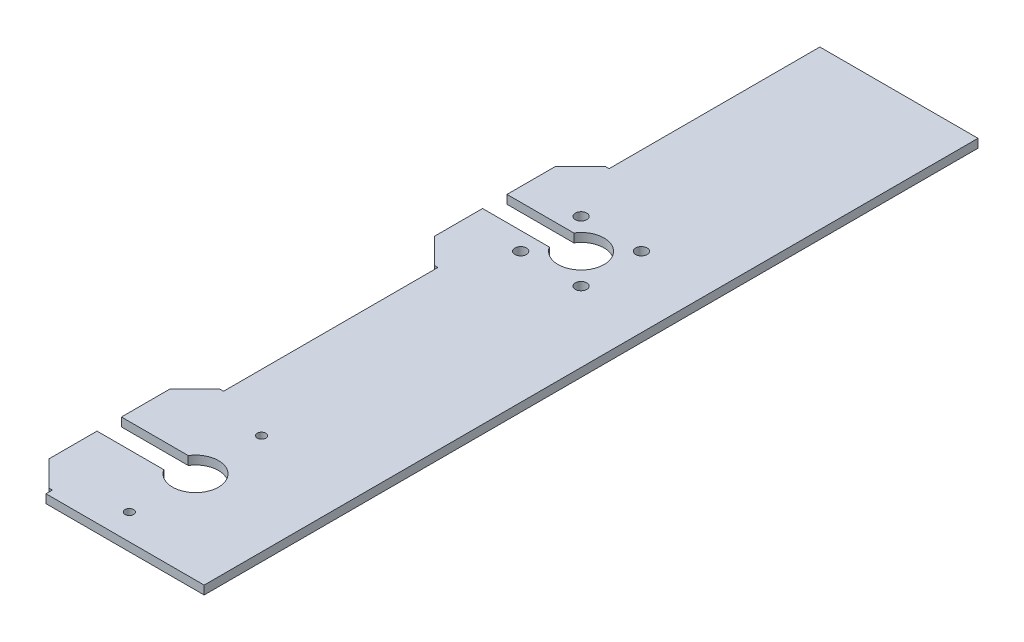
ISO-10303-21;
HEADER;
FILE_DESCRIPTION(('STEP AP214'),'2;1');
FILE_NAME('part.step','',(''),(''),'','','');
FILE_SCHEMA(('AUTOMOTIVE_DESIGN { 1 0 10303 214 1 1 1 1 }'));
ENDSEC;
DATA;
#1=APPLICATION_CONTEXT('core data for automotive mechanical design processes');
#2=APPLICATION_PROTOCOL_DEFINITION('international standard','automotive_design',2000,#1);
#3=PRODUCT_CONTEXT('',#1,'mechanical');
#4=PRODUCT('Part','Part','',(#3));
#5=PRODUCT_RELATED_PRODUCT_CATEGORY('part','',(#4));
#6=PRODUCT_DEFINITION_FORMATION('','',#4);
#7=PRODUCT_DEFINITION_CONTEXT('part definition',#1,'design');
#8=PRODUCT_DEFINITION('design','',#6,#7);
#9=PRODUCT_DEFINITION_SHAPE('','',#8);
#10=(LENGTH_UNIT() NAMED_UNIT(*) SI_UNIT(.MILLI.,.METRE.));
#11=(NAMED_UNIT(*) PLANE_ANGLE_UNIT() SI_UNIT($,.RADIAN.));
#12=(NAMED_UNIT(*) SI_UNIT($,.STERADIAN.) SOLID_ANGLE_UNIT());
#13=UNCERTAINTY_MEASURE_WITH_UNIT(LENGTH_MEASURE(1.E-05),#10,'distance_accuracy_value','');
#14=(GEOMETRIC_REPRESENTATION_CONTEXT(3) GLOBAL_UNCERTAINTY_ASSIGNED_CONTEXT((#13)) GLOBAL_UNIT_ASSIGNED_CONTEXT((#10,
#11,#12)) REPRESENTATION_CONTEXT('',''));
#15=CARTESIAN_POINT('',(0.,0.,0.));
#16=DIRECTION('',(0.,0.,1.));
#17=DIRECTION('',(1.,0.,0.));
#18=AXIS2_PLACEMENT_3D('',#15,#16,#17);
#19=CARTESIAN_POINT('',(-27.5,-3.,34.0400430645094));
#20=DIRECTION('',(1.,0.,0.));
#21=DIRECTION('',(0.,1.,0.));
#22=AXIS2_PLACEMENT_3D('',#19,#20,#21);
#23=PLANE('',#22);
#24=DIRECTION('',(0.,0.,-1.));
#25=VECTOR('',#24,1.);
#26=CARTESIAN_POINT('',(-27.5,-3.,34.0400430645094));
#27=LINE('',#26,#25);
#28=CARTESIAN_POINT('',(-27.5,-3.00000000000027,104.316686129019));
#29=VERTEX_POINT('',#28);
#30=CARTESIAN_POINT('',(-27.5,-3.,29.7634));
#31=VERTEX_POINT('',#30);
#32=EDGE_CURVE('E114',#29,#31,#27,.T.);
#33=ORIENTED_EDGE('',*,*,#32,.F.);
#34=DIRECTION('',(0.,-1.,0.));
#35=VECTOR('',#34,1.);
#36=CARTESIAN_POINT('',(-27.5,-2.70616862252382E-13,104.316686129019));
#37=LINE('',#36,#35);
#38=CARTESIAN_POINT('',(-27.5,-2.70616862252382E-13,104.316686129019));
#39=VERTEX_POINT('',#38);
#40=EDGE_CURVE('E372',#39,#29,#37,.T.);
#41=ORIENTED_EDGE('',*,*,#40,.F.);
#42=DIRECTION('',(0.,0.,1.));
#43=VECTOR('',#42,1.);
#44=CARTESIAN_POINT('',(-27.5,0.,34.0400430645094));
#45=LINE('',#44,#43);
#46=CARTESIAN_POINT('',(-27.5,0.,29.7634));
#47=VERTEX_POINT('',#46);
#48=EDGE_CURVE('E108',#39,#47,#45,.F.);
#49=ORIENTED_EDGE('',*,*,#48,.T.);
#50=DIRECTION('',(0.,-1.,0.));
#51=VECTOR('',#50,1.);
#52=CARTESIAN_POINT('',(-27.5,0.,29.7634));
#53=LINE('',#52,#51);
#54=EDGE_CURVE('E411',#47,#31,#53,.T.);
#55=ORIENTED_EDGE('',*,*,#54,.T.);
#56=EDGE_LOOP('',(#33,#41,#49,#55));
#57=FACE_BOUND('',#56,.T.);
#58=ADVANCED_FACE('F104',(#57),#23,.F.);
#59=CARTESIAN_POINT('',(27.5,-3.00000000000025,103.040043064509));
#60=DIRECTION('',(-1.,0.,0.));
#61=DIRECTION('',(0.,0.,-1.));
#62=AXIS2_PLACEMENT_3D('',#59,#60,#61);
#63=PLANE('',#62);
#64=DIRECTION('',(0.,0.,-1.));
#65=VECTOR('',#64,1.);
#66=CARTESIAN_POINT('',(27.5,-2.42861286636753E-13,103.040043064509));
#67=LINE('',#66,#65);
#68=CARTESIAN_POINT('',(27.5,-4.64905891561784E-13,-103.040043064509));
#69=VERTEX_POINT('',#68);
#70=CARTESIAN_POINT('',(27.5,-9.0205620750794E-13,166.070086129019));
#71=VERTEX_POINT('',#70);
#72=EDGE_CURVE('E278',#69,#71,#67,.F.);
#73=ORIENTED_EDGE('',*,*,#72,.T.);
#74=DIRECTION('',(0.,1.,0.));
#75=VECTOR('',#74,1.);
#76=CARTESIAN_POINT('',(27.5,-3.0000000000009,166.070086129019));
#77=LINE('',#76,#75);
#78=CARTESIAN_POINT('',(27.5,-3.0000000000009,166.070086129019));
#79=VERTEX_POINT('',#78);
#80=EDGE_CURVE('E377',#79,#71,#77,.T.);
#81=ORIENTED_EDGE('',*,*,#80,.F.);
#82=DIRECTION('',(0.,0.,1.));
#83=VECTOR('',#82,1.);
#84=CARTESIAN_POINT('',(27.5,-3.,34.0400430645094));
#85=LINE('',#84,#83);
#86=CARTESIAN_POINT('',(27.5,-3.00000000000047,-103.040043064509));
#87=VERTEX_POINT('',#86);
#88=EDGE_CURVE('E13',#87,#79,#85,.T.);
#89=ORIENTED_EDGE('',*,*,#88,.F.);
#90=DIRECTION('',(0.,1.,0.));
#91=VECTOR('',#90,1.);
#92=CARTESIAN_POINT('',(27.5,-3.00000000000047,-103.040043064509));
#93=LINE('',#92,#91);
#94=EDGE_CURVE('E292',#87,#69,#93,.T.);
#95=ORIENTED_EDGE('',*,*,#94,.T.);
#96=EDGE_LOOP('',(#73,#81,#89,#95));
#97=FACE_BOUND('',#96,.T.);
#98=ADVANCED_FACE('F295',(#97),#63,.F.);
#99=CARTESIAN_POINT('',(0.,-3.,34.0400430645094));
#100=DIRECTION('',(0.,1.,0.));
#101=DIRECTION('',(-1.,0.,0.));
#102=AXIS2_PLACEMENT_3D('',#99,#100,#101);
#103=PLANE('',#102);
#104=ORIENTED_EDGE('',*,*,#88,.T.);
#105=DIRECTION('',(-1.,0.,0.));
#106=VECTOR('',#105,1.);
#107=CARTESIAN_POINT('',(0.,-3.0000000000009,166.070086129019));
#108=LINE('',#107,#106);
#109=CARTESIAN_POINT('',(-27.5,-3.0000000000009,166.070086129019));
#110=VERTEX_POINT('',#109);
#111=EDGE_CURVE('E331',#79,#110,#108,.T.);
#112=ORIENTED_EDGE('',*,*,#111,.T.);
#113=DIRECTION('',(0.,0.,-1.));
#114=VECTOR('',#113,1.);
#115=CARTESIAN_POINT('',(-27.5,-3.00000000000057,134.080086129019));
#116=LINE('',#115,#114);
#117=CARTESIAN_POINT('',(-27.5,-3.00000000000087,163.843486129019));
#118=VERTEX_POINT('',#117);
#119=EDGE_CURVE('E328',#110,#118,#116,.T.);
#120=ORIENTED_EDGE('',*,*,#119,.T.);
#121=DIRECTION('',(-1.,0.,0.));
#122=VECTOR('',#121,1.);
#123=CARTESIAN_POINT('',(-28.7366,-3.00000000000087,163.843486129019));
#124=LINE('',#123,#122);
#125=CARTESIAN_POINT('',(-28.7366,-3.00000000000087,163.843486129019));
#126=VERTEX_POINT('',#125);
#127=EDGE_CURVE('E325',#118,#126,#124,.T.);
#128=ORIENTED_EDGE('',*,*,#127,.T.);
#129=DIRECTION('',(-0.707106781186549,0.,-0.707106781186546));
#130=VECTOR('',#129,1.);
#131=CARTESIAN_POINT('',(-37.5,-3.00000000000079,155.080086129019));
#132=LINE('',#131,#130);
#133=CARTESIAN_POINT('',(-37.5,-3.00000000000079,155.080086129019));
#134=VERTEX_POINT('',#133);
#135=EDGE_CURVE('E321',#126,#134,#132,.T.);
#136=ORIENTED_EDGE('',*,*,#135,.T.);
#137=DIRECTION('',(0.,0.,-1.));
#138=VECTOR('',#137,1.);
#139=CARTESIAN_POINT('',(-37.5,-3.00000000000036,113.080086129019));
#140=LINE('',#139,#138);
#141=CARTESIAN_POINT('',(-37.5,-3.00000000000061,138.330086129019));
#142=VERTEX_POINT('',#141);
#143=EDGE_CURVE('E318',#134,#142,#140,.T.);
#144=ORIENTED_EDGE('',*,*,#143,.T.);
#145=DIRECTION('',(-1.,0.,0.));
#146=VECTOR('',#145,1.);
#147=CARTESIAN_POINT('',(-37.5,-3.00000000000061,138.330086129019));
#148=LINE('',#147,#146);
#149=CARTESIAN_POINT('',(-14.277720855863,-3.00000000000061,138.330086129019));
#150=VERTEX_POINT('',#149);
#151=EDGE_CURVE('E394',#150,#142,#148,.T.);
#152=ORIENTED_EDGE('',*,*,#151,.F.);
#153=CARTESIAN_POINT('',(-7.50000000000002,-3.00000000000057,134.080086129019));
#154=DIRECTION('',(0.,-1.,0.));
#155=DIRECTION('',(0.,0.,-1.));
#156=AXIS2_PLACEMENT_3D('',#153,#154,#155);
#157=CIRCLE('',#156,8.);
#158=CARTESIAN_POINT('',(-14.277720855863,-3.00000000000053,129.830086129019));
#159=VERTEX_POINT('',#158);
#160=EDGE_CURVE('E346',#159,#150,#157,.T.);
#161=ORIENTED_EDGE('',*,*,#160,.F.);
#162=DIRECTION('',(1.,0.,0.));
#163=VECTOR('',#162,1.);
#164=CARTESIAN_POINT('',(-37.5,-3.00000000000053,129.830086129019));
#165=LINE('',#164,#163);
#166=CARTESIAN_POINT('',(-37.5,-3.00000000000053,129.830086129019));
#167=VERTEX_POINT('',#166);
#168=EDGE_CURVE('E352',#167,#159,#165,.T.);
#169=ORIENTED_EDGE('',*,*,#168,.F.);
#170=CARTESIAN_POINT('',(-37.5,-3.00000000000036,113.080086129019));
#171=VERTEX_POINT('',#170);
#172=EDGE_CURVE('E322',#167,#171,#140,.T.);
#173=ORIENTED_EDGE('',*,*,#172,.T.);
#174=DIRECTION('',(0.707106781186548,0.,-0.707106781186547));
#175=VECTOR('',#174,1.);
#176=CARTESIAN_POINT('',(-28.7366,-3.00000000000027,104.316686129019));
#177=LINE('',#176,#175);
#178=CARTESIAN_POINT('',(-28.7366,-3.00000000000027,104.316686129019));
#179=VERTEX_POINT('',#178);
#180=EDGE_CURVE('E336',#171,#179,#177,.T.);
#181=ORIENTED_EDGE('',*,*,#180,.T.);
#182=DIRECTION('',(1.,0.,0.));
#183=VECTOR('',#182,1.);
#184=CARTESIAN_POINT('',(-27.5,-3.00000000000027,104.316686129019));
#185=LINE('',#184,#183);
#186=EDGE_CURVE('E333',#179,#29,#185,.T.);
#187=ORIENTED_EDGE('',*,*,#186,.T.);
#188=ORIENTED_EDGE('',*,*,#32,.T.);
#189=DIRECTION('',(-1.,0.,0.));
#190=VECTOR('',#189,1.);
#191=CARTESIAN_POINT('',(0.,-3.,29.7634));
#192=LINE('',#191,#190);
#193=CARTESIAN_POINT('',(-28.7366,-3.,29.7634));
#194=VERTEX_POINT('',#193);
#195=EDGE_CURVE('E403',#31,#194,#192,.T.);
#196=ORIENTED_EDGE('',*,*,#195,.T.);
#197=DIRECTION('',(0.707106781186548,0.,0.707106781186547));
#198=VECTOR('',#197,1.);
#199=CARTESIAN_POINT('',(-37.5,-3.,21.));
#200=LINE('',#199,#198);
#201=CARTESIAN_POINT('',(-37.5,-3.,21.));
#202=VERTEX_POINT('',#201);
#203=EDGE_CURVE('E481',#202,#194,#200,.T.);
#204=ORIENTED_EDGE('',*,*,#203,.F.);
#205=DIRECTION('',(0.,0.,1.));
#206=VECTOR('',#205,1.);
#207=CARTESIAN_POINT('',(-37.5,-3.,-21.));
#208=LINE('',#207,#206);
#209=CARTESIAN_POINT('',(-37.5,-2.99999999999989,4.24999999999998));
#210=VERTEX_POINT('',#209);
#211=EDGE_CURVE('E462',#210,#202,#208,.T.);
#212=ORIENTED_EDGE('',*,*,#211,.F.);
#213=DIRECTION('',(1.,0.,0.));
#214=VECTOR('',#213,1.);
#215=CARTESIAN_POINT('',(-37.5,-2.99999999999989,4.24999999999998));
#216=LINE('',#215,#214);
#217=CARTESIAN_POINT('',(-14.277720855863,-2.99999999999989,4.24999999999998));
#218=VERTEX_POINT('',#217);
#219=EDGE_CURVE('E444',#210,#218,#216,.T.);
#220=ORIENTED_EDGE('',*,*,#219,.T.);
#221=CARTESIAN_POINT('',(-7.50000000000001,-3.,0.));
#222=DIRECTION('',(0.,1.,0.));
#223=DIRECTION('',(0.,0.,1.));
#224=AXIS2_PLACEMENT_3D('',#221,#222,#223);
#225=CIRCLE('',#224,8.);
#226=CARTESIAN_POINT('',(-14.277720855863,-3.,-4.25000000000002));
#227=VERTEX_POINT('',#226);
#228=EDGE_CURVE('E441',#218,#227,#225,.T.);
#229=ORIENTED_EDGE('',*,*,#228,.T.);
#230=DIRECTION('',(-1.,0.,0.));
#231=VECTOR('',#230,1.);
#232=CARTESIAN_POINT('',(-37.5,-2.99999999999986,-4.25000000000002));
#233=LINE('',#232,#231);
#234=CARTESIAN_POINT('',(-37.5,-2.99999999999986,-4.25000000000002));
#235=VERTEX_POINT('',#234);
#236=EDGE_CURVE('E438',#227,#235,#233,.T.);
#237=ORIENTED_EDGE('',*,*,#236,.T.);
#238=CARTESIAN_POINT('',(-37.5,-3.,-21.));
#239=VERTEX_POINT('',#238);
#240=EDGE_CURVE('E458',#239,#235,#208,.T.);
#241=ORIENTED_EDGE('',*,*,#240,.F.);
#242=DIRECTION('',(-0.707106781186549,0.,0.707106781186546));
#243=VECTOR('',#242,1.);
#244=CARTESIAN_POINT('',(-27.5,-3.,-31.));
#245=LINE('',#244,#243);
#246=CARTESIAN_POINT('',(-28.7366,-3.,-29.7634));
#247=VERTEX_POINT('',#246);
#248=EDGE_CURVE('E467',#247,#239,#245,.T.);
#249=ORIENTED_EDGE('',*,*,#248,.F.);
#250=DIRECTION('',(1.,0.,0.));
#251=VECTOR('',#250,1.);
#252=CARTESIAN_POINT('',(0.,-3.,-29.7634));
#253=LINE('',#252,#251);
#254=CARTESIAN_POINT('',(-27.5,-3.,-29.7634));
#255=VERTEX_POINT('',#254);
#256=EDGE_CURVE('E415',#247,#255,#253,.T.);
#257=ORIENTED_EDGE('',*,*,#256,.T.);
#258=DIRECTION('',(0.,0.,-1.));
#259=VECTOR('',#258,1.);
#260=CARTESIAN_POINT('',(-27.5,-3.,-34.0400430645093));
#261=LINE('',#260,#259);
#262=CARTESIAN_POINT('',(-27.5,-3.00000000000047,-103.040043064509));
#263=VERTEX_POINT('',#262);
#264=EDGE_CURVE('E297',#255,#263,#261,.T.);
#265=ORIENTED_EDGE('',*,*,#264,.T.);
#266=DIRECTION('',(1.,0.,0.));
#267=VECTOR('',#266,1.);
#268=CARTESIAN_POINT('',(0.,-3.00000000000047,-103.040043064509));
#269=LINE('',#268,#267);
#270=EDGE_CURVE('E299',#263,#87,#269,.T.);
#271=ORIENTED_EDGE('',*,*,#270,.T.);
#272=EDGE_LOOP('',(#104,#112,#120,#128,#136,#144,#152,#161,#169,#173,#181,#187,#188,#196,#204,
#212,#220,#229,#237,#241,#249,#257,#265,#271));
#273=FACE_BOUND('',#272,.T.);
#274=CARTESIAN_POINT('',(-7.50000000000002,-3.00000000000033,111.080086129019));
#275=DIRECTION('',(0.,-1.,0.));
#276=DIRECTION('',(0.,0.,-1.));
#277=AXIS2_PLACEMENT_3D('',#274,#275,#276);
#278=CIRCLE('',#277,1.5);
#279=CARTESIAN_POINT('',(-7.50000000000002,-3.00000000000031,109.580086129019));
#280=VERTEX_POINT('',#279);
#281=EDGE_CURVE('E339',#280,#280,#278,.T.);
#282=ORIENTED_EDGE('',*,*,#281,.F.);
#283=EDGE_LOOP('',(#282));
#284=FACE_BOUND('',#283,.T.);
#285=CARTESIAN_POINT('',(-7.50000000000002,-3.00000000000082,157.080086129019));
#286=DIRECTION('',(0.,-1.,0.));
#287=DIRECTION('',(0.,0.,-1.));
#288=AXIS2_PLACEMENT_3D('',#285,#286,#287);
#289=CIRCLE('',#288,1.5);
#290=CARTESIAN_POINT('',(-7.50000000000002,-3.00000000000081,155.580086129019));
#291=VERTEX_POINT('',#290);
#292=EDGE_CURVE('E342',#291,#291,#289,.T.);
#293=ORIENTED_EDGE('',*,*,#292,.F.);
#294=EDGE_LOOP('',(#293));
#295=FACE_BOUND('',#294,.T.);
#296=CARTESIAN_POINT('',(-18.,-3.,10.5));
#297=DIRECTION('',(0.,1.,0.));
#298=DIRECTION('',(0.,0.,1.));
#299=AXIS2_PLACEMENT_3D('',#296,#297,#298);
#300=CIRCLE('',#299,2.);
#301=CARTESIAN_POINT('',(-18.,-3.,12.5));
#302=VERTEX_POINT('',#301);
#303=EDGE_CURVE('E414',#302,#302,#300,.T.);
#304=ORIENTED_EDGE('',*,*,#303,.T.);
#305=EDGE_LOOP('',(#304));
#306=FACE_BOUND('',#305,.T.);
#307=CARTESIAN_POINT('',(2.99999999999999,-3.,10.5));
#308=DIRECTION('',(0.,1.,0.));
#309=DIRECTION('',(0.,0.,1.));
#310=AXIS2_PLACEMENT_3D('',#307,#308,#309);
#311=CIRCLE('',#310,2.);
#312=CARTESIAN_POINT('',(2.99999999999999,-3.,12.5));
#313=VERTEX_POINT('',#312);
#314=EDGE_CURVE('E431',#313,#313,#311,.T.);
#315=ORIENTED_EDGE('',*,*,#314,.T.);
#316=EDGE_LOOP('',(#315));
#317=FACE_BOUND('',#316,.T.);
#318=CARTESIAN_POINT('',(2.99999999999999,-3.,-10.5));
#319=DIRECTION('',(0.,1.,0.));
#320=DIRECTION('',(0.,0.,1.));
#321=AXIS2_PLACEMENT_3D('',#318,#319,#320);
#322=CIRCLE('',#321,2.);
#323=CARTESIAN_POINT('',(2.99999999999999,-3.,-8.5));
#324=VERTEX_POINT('',#323);
#325=EDGE_CURVE('E425',#324,#324,#322,.T.);
#326=ORIENTED_EDGE('',*,*,#325,.T.);
#327=EDGE_LOOP('',(#326));
#328=FACE_BOUND('',#327,.T.);
#329=CARTESIAN_POINT('',(-18.,-3.,-10.5));
#330=DIRECTION('',(0.,1.,0.));
#331=DIRECTION('',(0.,0.,1.));
#332=AXIS2_PLACEMENT_3D('',#329,#330,#331);
#333=CIRCLE('',#332,2.);
#334=CARTESIAN_POINT('',(-18.,-3.,-8.5));
#335=VERTEX_POINT('',#334);
#336=EDGE_CURVE('E419',#335,#335,#333,.T.);
#337=ORIENTED_EDGE('',*,*,#336,.T.);
#338=EDGE_LOOP('',(#337));
#339=FACE_BOUND('',#338,.T.);
#340=ADVANCED_FACE('F400',(#273,#284,#295,#306,#317,#328,#339),#103,.F.);
#341=CARTESIAN_POINT('',(0.,0.,0.));
#342=DIRECTION('',(0.,-1.,0.));
#343=DIRECTION('',(0.,0.,-1.));
#344=AXIS2_PLACEMENT_3D('',#341,#342,#343);
#345=PLANE('',#344);
#346=ORIENTED_EDGE('',*,*,#48,.F.);
#347=DIRECTION('',(1.,0.,0.));
#348=VECTOR('',#347,1.);
#349=CARTESIAN_POINT('',(-27.5,-2.70616862252382E-13,104.316686129019));
#350=LINE('',#349,#348);
#351=CARTESIAN_POINT('',(-28.7366,-2.70616862252382E-13,104.316686129019));
#352=VERTEX_POINT('',#351);
#353=EDGE_CURVE('E374',#352,#39,#350,.T.);
#354=ORIENTED_EDGE('',*,*,#353,.F.);
#355=DIRECTION('',(0.707106781186548,0.,-0.707106781186547));
#356=VECTOR('',#355,1.);
#357=CARTESIAN_POINT('',(-28.7366,-2.70616862252382E-13,104.316686129019));
#358=LINE('',#357,#356);
#359=CARTESIAN_POINT('',(-37.5,-3.60822483003176E-13,113.080086129019));
#360=VERTEX_POINT('',#359);
#361=EDGE_CURVE('E369',#360,#352,#358,.T.);
#362=ORIENTED_EDGE('',*,*,#361,.F.);
#363=DIRECTION('',(0.,0.,-1.));
#364=VECTOR('',#363,1.);
#365=CARTESIAN_POINT('',(-37.5,-3.60822483003176E-13,113.080086129019));
#366=LINE('',#365,#364);
#367=CARTESIAN_POINT('',(-37.5,-4.71844785465692E-13,129.830086129019));
#368=VERTEX_POINT('',#367);
#369=EDGE_CURVE('E361',#368,#360,#366,.T.);
#370=ORIENTED_EDGE('',*,*,#369,.F.);
#371=DIRECTION('',(-1.,0.,0.));
#372=VECTOR('',#371,1.);
#373=CARTESIAN_POINT('',(0.,-5.27355936696949E-13,129.830086129019));
#374=LINE('',#373,#372);
#375=CARTESIAN_POINT('',(-14.277720855863,-5.13478148889135E-13,129.830086129019));
#376=VERTEX_POINT('',#375);
#377=EDGE_CURVE('E356',#376,#368,#374,.T.);
#378=ORIENTED_EDGE('',*,*,#377,.F.);
#379=CARTESIAN_POINT('',(-7.50000000000002,-5.68989300120393E-13,134.080086129019));
#380=DIRECTION('',(0.,-1.,0.));
#381=DIRECTION('',(0.,0.,-1.));
#382=AXIS2_PLACEMENT_3D('',#379,#380,#381);
#383=CIRCLE('',#382,8.);
#384=CARTESIAN_POINT('',(-14.277720855863,-6.10622663543836E-13,138.330086129019));
#385=VERTEX_POINT('',#384);
#386=EDGE_CURVE('E315',#376,#385,#383,.T.);
#387=ORIENTED_EDGE('',*,*,#386,.T.);
#388=DIRECTION('',(1.,0.,0.));
#389=VECTOR('',#388,1.);
#390=CARTESIAN_POINT('',(0.,-6.10622663543836E-13,138.330086129019));
#391=LINE('',#390,#389);
#392=CARTESIAN_POINT('',(-37.5,-5.27355936696949E-13,138.330086129019));
#393=VERTEX_POINT('',#392);
#394=EDGE_CURVE('E197',#393,#385,#391,.T.);
#395=ORIENTED_EDGE('',*,*,#394,.F.);
#396=CARTESIAN_POINT('',(-37.5,-7.84095011141517E-13,155.080086129019));
#397=VERTEX_POINT('',#396);
#398=EDGE_CURVE('E362',#397,#393,#366,.T.);
#399=ORIENTED_EDGE('',*,*,#398,.F.);
#400=DIRECTION('',(-0.707106781186549,0.,-0.707106781186546));
#401=VECTOR('',#400,1.);
#402=CARTESIAN_POINT('',(-37.5,-7.84095011141517E-13,155.080086129019));
#403=LINE('',#402,#401);
#404=CARTESIAN_POINT('',(-28.7366,-8.67361737988404E-13,163.843486129019));
#405=VERTEX_POINT('',#404);
#406=EDGE_CURVE('E365',#405,#397,#403,.T.);
#407=ORIENTED_EDGE('',*,*,#406,.F.);
#408=DIRECTION('',(-1.,0.,0.));
#409=VECTOR('',#408,1.);
#410=CARTESIAN_POINT('',(-28.7366,-8.67361737988404E-13,163.843486129019));
#411=LINE('',#410,#409);
#412=CARTESIAN_POINT('',(-27.5,-8.67361737988404E-13,163.843486129019));
#413=VERTEX_POINT('',#412);
#414=EDGE_CURVE('E385',#413,#405,#411,.T.);
#415=ORIENTED_EDGE('',*,*,#414,.F.);
#416=DIRECTION('',(0.,0.,1.));
#417=VECTOR('',#416,1.);
#418=CARTESIAN_POINT('',(-27.5,-2.35922392732846E-13,102.080086129019));
#419=LINE('',#418,#417);
#420=CARTESIAN_POINT('',(-27.5,-9.0205620750794E-13,166.070086129019));
#421=VERTEX_POINT('',#420);
#422=EDGE_CURVE('E305',#421,#413,#419,.F.);
#423=ORIENTED_EDGE('',*,*,#422,.F.);
#424=DIRECTION('',(1.,0.,0.));
#425=VECTOR('',#424,1.);
#426=CARTESIAN_POINT('',(-27.5,-9.0205620750794E-13,166.070086129019));
#427=LINE('',#426,#425);
#428=EDGE_CURVE('E283',#71,#421,#427,.F.);
#429=ORIENTED_EDGE('',*,*,#428,.F.);
#430=ORIENTED_EDGE('',*,*,#72,.F.);
#431=DIRECTION('',(-1.,0.,0.));
#432=VECTOR('',#431,1.);
#433=CARTESIAN_POINT('',(27.5,-4.64905891561784E-13,-103.040043064509));
#434=LINE('',#433,#432);
#435=CARTESIAN_POINT('',(-27.5,-4.71844785465692E-13,-103.040043064509));
#436=VERTEX_POINT('',#435);
#437=EDGE_CURVE('E281',#436,#69,#434,.F.);
#438=ORIENTED_EDGE('',*,*,#437,.F.);
#439=DIRECTION('',(0.,0.,1.));
#440=VECTOR('',#439,1.);
#441=CARTESIAN_POINT('',(-27.5,-4.71844785465692E-13,-103.040043064509));
#442=LINE('',#441,#440);
#443=CARTESIAN_POINT('',(-27.5,0.,-29.7634));
#444=VERTEX_POINT('',#443);
#445=EDGE_CURVE('E273',#444,#436,#442,.F.);
#446=ORIENTED_EDGE('',*,*,#445,.F.);
#447=DIRECTION('',(1.,0.,0.));
#448=VECTOR('',#447,1.);
#449=CARTESIAN_POINT('',(-29.,0.,-29.7634));
#450=LINE('',#449,#448);
#451=CARTESIAN_POINT('',(-28.7366,0.,-29.7634));
#452=VERTEX_POINT('',#451);
#453=EDGE_CURVE('E475',#452,#444,#450,.T.);
#454=ORIENTED_EDGE('',*,*,#453,.F.);
#455=DIRECTION('',(-0.707106781186549,0.,0.707106781186546));
#456=VECTOR('',#455,1.);
#457=CARTESIAN_POINT('',(-27.5,0.,-31.));
#458=LINE('',#457,#456);
#459=CARTESIAN_POINT('',(-37.5,0.,-21.));
#460=VERTEX_POINT('',#459);
#461=EDGE_CURVE('E205',#452,#460,#458,.T.);
#462=ORIENTED_EDGE('',*,*,#461,.T.);
#463=DIRECTION('',(0.,0.,1.));
#464=VECTOR('',#463,1.);
#465=CARTESIAN_POINT('',(-37.5,0.,-21.));
#466=LINE('',#465,#464);
#467=CARTESIAN_POINT('',(-37.5,0.,-4.25000000000001));
#468=VERTEX_POINT('',#467);
#469=EDGE_CURVE('E978',#460,#468,#466,.T.);
#470=ORIENTED_EDGE('',*,*,#469,.T.);
#471=DIRECTION('',(1.,0.,0.));
#472=VECTOR('',#471,1.);
#473=CARTESIAN_POINT('',(0.,0.,-4.25000000000001));
#474=LINE('',#473,#472);
#475=CARTESIAN_POINT('',(-14.277720855863,0.,-4.25000000000002));
#476=VERTEX_POINT('',#475);
#477=EDGE_CURVE('E396',#468,#476,#474,.T.);
#478=ORIENTED_EDGE('',*,*,#477,.T.);
#479=CARTESIAN_POINT('',(-7.50000000000001,0.,0.));
#480=DIRECTION('',(0.,1.,0.));
#481=DIRECTION('',(0.,0.,1.));
#482=AXIS2_PLACEMENT_3D('',#479,#480,#481);
#483=CIRCLE('',#482,8.);
#484=CARTESIAN_POINT('',(-14.277720855863,0.,4.24999999999998));
#485=VERTEX_POINT('',#484);
#486=EDGE_CURVE('E452',#485,#476,#483,.T.);
#487=ORIENTED_EDGE('',*,*,#486,.F.);
#488=DIRECTION('',(-1.,0.,0.));
#489=VECTOR('',#488,1.);
#490=CARTESIAN_POINT('',(0.,0.,4.24999999999999));
#491=LINE('',#490,#489);
#492=CARTESIAN_POINT('',(-37.5,0.,4.24999999999999));
#493=VERTEX_POINT('',#492);
#494=EDGE_CURVE('E418',#485,#493,#491,.T.);
#495=ORIENTED_EDGE('',*,*,#494,.T.);
#496=CARTESIAN_POINT('',(-37.5,0.,21.));
#497=VERTEX_POINT('',#496);
#498=EDGE_CURVE('E422',#493,#497,#466,.T.);
#499=ORIENTED_EDGE('',*,*,#498,.T.);
#500=DIRECTION('',(0.707106781186548,0.,0.707106781186547));
#501=VECTOR('',#500,1.);
#502=CARTESIAN_POINT('',(-37.5,0.,21.));
#503=LINE('',#502,#501);
#504=CARTESIAN_POINT('',(-28.7366,0.,29.7634));
#505=VERTEX_POINT('',#504);
#506=EDGE_CURVE('E967',#497,#505,#503,.T.);
#507=ORIENTED_EDGE('',*,*,#506,.T.);
#508=DIRECTION('',(-1.,0.,0.));
#509=VECTOR('',#508,1.);
#510=CARTESIAN_POINT('',(-27.5,0.,29.7634));
#511=LINE('',#510,#509);
#512=EDGE_CURVE('E478',#47,#505,#511,.T.);
#513=ORIENTED_EDGE('',*,*,#512,.F.);
#514=EDGE_LOOP('',(#346,#354,#362,#370,#378,#387,#395,#399,#407,#415,#423,#429,#430,#438,#446,
#454,#462,#470,#478,#487,#495,#499,#507,#513));
#515=FACE_BOUND('',#514,.T.);
#516=CARTESIAN_POINT('',(-7.50000000000002,-3.2612801348364E-13,111.080086129019));
#517=DIRECTION('',(0.,-1.,0.));
#518=DIRECTION('',(0.,0.,-1.));
#519=AXIS2_PLACEMENT_3D('',#516,#517,#518);
#520=CIRCLE('',#519,1.5);
#521=CARTESIAN_POINT('',(-7.50000000000002,-3.10448585760476E-13,109.580086129019));
#522=VERTEX_POINT('',#521);
#523=EDGE_CURVE('E312',#522,#522,#520,.T.);
#524=ORIENTED_EDGE('',*,*,#523,.T.);
#525=EDGE_LOOP('',(#524));
#526=FACE_BOUND('',#525,.T.);
#527=CARTESIAN_POINT('',(-7.50000000000002,-8.18789480661053E-13,157.080086129019));
#528=DIRECTION('',(0.,-1.,0.));
#529=DIRECTION('',(0.,0.,-1.));
#530=AXIS2_PLACEMENT_3D('',#527,#528,#529);
#531=CIRCLE('',#530,1.5);
#532=CARTESIAN_POINT('',(-7.50000000000002,-8.03110052937889E-13,155.580086129019));
#533=VERTEX_POINT('',#532);
#534=EDGE_CURVE('E309',#533,#533,#531,.T.);
#535=ORIENTED_EDGE('',*,*,#534,.T.);
#536=EDGE_LOOP('',(#535));
#537=FACE_BOUND('',#536,.T.);
#538=CARTESIAN_POINT('',(-18.,0.,10.5));
#539=DIRECTION('',(0.,1.,0.));
#540=DIRECTION('',(0.,0.,1.));
#541=AXIS2_PLACEMENT_3D('',#538,#539,#540);
#542=CIRCLE('',#541,2.);
#543=CARTESIAN_POINT('',(-18.,0.,12.5));
#544=VERTEX_POINT('',#543);
#545=EDGE_CURVE('E486',#544,#544,#542,.T.);
#546=ORIENTED_EDGE('',*,*,#545,.F.);
#547=EDGE_LOOP('',(#546));
#548=FACE_BOUND('',#547,.T.);
#549=CARTESIAN_POINT('',(2.99999999999999,0.,10.5));
#550=DIRECTION('',(0.,1.,0.));
#551=DIRECTION('',(0.,0.,1.));
#552=AXIS2_PLACEMENT_3D('',#549,#550,#551);
#553=CIRCLE('',#552,2.);
#554=CARTESIAN_POINT('',(2.99999999999999,0.,12.5));
#555=VERTEX_POINT('',#554);
#556=EDGE_CURVE('E489',#555,#555,#553,.T.);
#557=ORIENTED_EDGE('',*,*,#556,.F.);
#558=EDGE_LOOP('',(#557));
#559=FACE_BOUND('',#558,.T.);
#560=CARTESIAN_POINT('',(2.99999999999999,0.,-10.5));
#561=DIRECTION('',(0.,1.,0.));
#562=DIRECTION('',(0.,0.,1.));
#563=AXIS2_PLACEMENT_3D('',#560,#561,#562);
#564=CIRCLE('',#563,2.);
#565=CARTESIAN_POINT('',(2.99999999999999,0.,-8.5));
#566=VERTEX_POINT('',#565);
#567=EDGE_CURVE('E492',#566,#566,#564,.T.);
#568=ORIENTED_EDGE('',*,*,#567,.F.);
#569=EDGE_LOOP('',(#568));
#570=FACE_BOUND('',#569,.T.);
#571=CARTESIAN_POINT('',(-18.,0.,-10.5));
#572=DIRECTION('',(0.,1.,0.));
#573=DIRECTION('',(0.,0.,1.));
#574=AXIS2_PLACEMENT_3D('',#571,#572,#573);
#575=CIRCLE('',#574,2.);
#576=CARTESIAN_POINT('',(-18.,0.,-8.5));
#577=VERTEX_POINT('',#576);
#578=EDGE_CURVE('E495',#577,#577,#575,.T.);
#579=ORIENTED_EDGE('',*,*,#578,.F.);
#580=EDGE_LOOP('',(#579));
#581=FACE_BOUND('',#580,.T.);
#582=ADVANCED_FACE('F106',(#515,#526,#537,#548,#559,#570,#581),#345,.F.);
#583=CARTESIAN_POINT('',(-37.5,68.9999999999994,138.330086129019));
#584=DIRECTION('',(0.,0.,1.));
#585=DIRECTION('',(0.,-1.,0.));
#586=AXIS2_PLACEMENT_3D('',#583,#584,#585);
#587=PLANE('',#586);
#588=ORIENTED_EDGE('',*,*,#394,.T.);
#589=DIRECTION('',(0.,-1.,0.));
#590=VECTOR('',#589,1.);
#591=CARTESIAN_POINT('',(-14.277720855863,-6.10622663543836E-13,138.330086129019));
#592=LINE('',#591,#590);
#593=EDGE_CURVE('E193',#150,#385,#592,.F.);
#594=ORIENTED_EDGE('',*,*,#593,.F.);
#595=ORIENTED_EDGE('',*,*,#151,.T.);
#596=DIRECTION('',(0.,-1.,0.));
#597=VECTOR('',#596,1.);
#598=CARTESIAN_POINT('',(-37.5,68.9999999999994,138.330086129019));
#599=LINE('',#598,#597);
#600=EDGE_CURVE('E366',#393,#142,#599,.T.);
#601=ORIENTED_EDGE('',*,*,#600,.F.);
#602=EDGE_LOOP('',(#588,#594,#595,#601));
#603=FACE_BOUND('',#602,.T.);
#604=ADVANCED_FACE('F565',(#603),#587,.F.);
#605=CARTESIAN_POINT('',(-37.5,-3.60822483003176E-13,113.080086129019));
#606=DIRECTION('',(-1.,0.,0.));
#607=DIRECTION('',(0.,0.,-1.));
#608=AXIS2_PLACEMENT_3D('',#605,#606,#607);
#609=PLANE('',#608);
#610=ORIENTED_EDGE('',*,*,#600,.T.);
#611=ORIENTED_EDGE('',*,*,#143,.F.);
#612=DIRECTION('',(0.,-1.,0.));
#613=VECTOR('',#612,1.);
#614=CARTESIAN_POINT('',(-37.5,-7.84095011141517E-13,155.080086129019));
#615=LINE('',#614,#613);
#616=EDGE_CURVE('E388',#397,#134,#615,.T.);
#617=ORIENTED_EDGE('',*,*,#616,.F.);
#618=ORIENTED_EDGE('',*,*,#398,.T.);
#619=EDGE_LOOP('',(#610,#611,#617,#618));
#620=FACE_BOUND('',#619,.T.);
#621=ADVANCED_FACE('F561',(#620),#609,.T.);
#622=CARTESIAN_POINT('',(-37.5,-7.84095011141517E-13,155.080086129019));
#623=DIRECTION('',(-0.707106781186546,0.,0.707106781186549));
#624=DIRECTION('',(-0.707106781186549,0.,-0.707106781186546));
#625=AXIS2_PLACEMENT_3D('',#622,#623,#624);
#626=PLANE('',#625);
#627=ORIENTED_EDGE('',*,*,#135,.F.);
#628=DIRECTION('',(0.,-1.,0.));
#629=VECTOR('',#628,1.);
#630=CARTESIAN_POINT('',(-28.7366,-8.67361737988404E-13,163.843486129019));
#631=LINE('',#630,#629);
#632=EDGE_CURVE('E308',#405,#126,#631,.T.);
#633=ORIENTED_EDGE('',*,*,#632,.F.);
#634=ORIENTED_EDGE('',*,*,#406,.T.);
#635=ORIENTED_EDGE('',*,*,#616,.T.);
#636=EDGE_LOOP('',(#627,#633,#634,#635));
#637=FACE_BOUND('',#636,.T.);
#638=ADVANCED_FACE('F557',(#637),#626,.T.);
#639=CARTESIAN_POINT('',(-28.7366,-8.67361737988404E-13,163.843486129019));
#640=DIRECTION('',(0.,0.,1.));
#641=DIRECTION('',(0.,-1.,0.));
#642=AXIS2_PLACEMENT_3D('',#639,#640,#641);
#643=PLANE('',#642);
#644=ORIENTED_EDGE('',*,*,#127,.F.);
#645=DIRECTION('',(0.,-1.,0.));
#646=VECTOR('',#645,1.);
#647=CARTESIAN_POINT('',(-27.5,-8.67361737988404E-13,163.843486129019));
#648=LINE('',#647,#646);
#649=EDGE_CURVE('E307',#413,#118,#648,.T.);
#650=ORIENTED_EDGE('',*,*,#649,.F.);
#651=ORIENTED_EDGE('',*,*,#414,.T.);
#652=ORIENTED_EDGE('',*,*,#632,.T.);
#653=EDGE_LOOP('',(#644,#650,#651,#652));
#654=FACE_BOUND('',#653,.T.);
#655=ADVANCED_FACE('F553',(#654),#643,.T.);
#656=CARTESIAN_POINT('',(-27.5,-3.00000000000024,102.080086129019));
#657=DIRECTION('',(1.,0.,0.));
#658=DIRECTION('',(0.,0.,1.));
#659=AXIS2_PLACEMENT_3D('',#656,#657,#658);
#660=PLANE('',#659);
#661=ORIENTED_EDGE('',*,*,#422,.T.);
#662=ORIENTED_EDGE('',*,*,#649,.T.);
#663=ORIENTED_EDGE('',*,*,#119,.F.);
#664=DIRECTION('',(0.,1.,0.));
#665=VECTOR('',#664,1.);
#666=CARTESIAN_POINT('',(-27.5,-3.0000000000009,166.070086129019));
#667=LINE('',#666,#665);
#668=EDGE_CURVE('E380',#110,#421,#667,.T.);
#669=ORIENTED_EDGE('',*,*,#668,.T.);
#670=EDGE_LOOP('',(#661,#662,#663,#669));
#671=FACE_BOUND('',#670,.T.);
#672=ADVANCED_FACE('F549',(#671),#660,.F.);
#673=CARTESIAN_POINT('',(-27.5,-3.0000000000009,166.070086129019));
#674=DIRECTION('',(0.,0.,-1.));
#675=DIRECTION('',(0.,1.,0.));
#676=AXIS2_PLACEMENT_3D('',#673,#674,#675);
#677=PLANE('',#676);
#678=ORIENTED_EDGE('',*,*,#428,.T.);
#679=ORIENTED_EDGE('',*,*,#668,.F.);
#680=ORIENTED_EDGE('',*,*,#111,.F.);
#681=ORIENTED_EDGE('',*,*,#80,.T.);
#682=EDGE_LOOP('',(#678,#679,#680,#681));
#683=FACE_BOUND('',#682,.T.);
#684=ADVANCED_FACE('F545',(#683),#677,.F.);
#685=CARTESIAN_POINT('',(-27.5,-2.70616862252382E-13,104.316686129019));
#686=DIRECTION('',(0.,0.,-1.));
#687=DIRECTION('',(0.,1.,0.));
#688=AXIS2_PLACEMENT_3D('',#685,#686,#687);
#689=PLANE('',#688);
#690=ORIENTED_EDGE('',*,*,#186,.F.);
#691=DIRECTION('',(0.,-1.,0.));
#692=VECTOR('',#691,1.);
#693=CARTESIAN_POINT('',(-28.7366,-2.70616862252382E-13,104.316686129019));
#694=LINE('',#693,#692);
#695=EDGE_CURVE('E367',#352,#179,#694,.T.);
#696=ORIENTED_EDGE('',*,*,#695,.F.);
#697=ORIENTED_EDGE('',*,*,#353,.T.);
#698=ORIENTED_EDGE('',*,*,#40,.T.);
#699=EDGE_LOOP('',(#690,#696,#697,#698));
#700=FACE_BOUND('',#699,.T.);
#701=ADVANCED_FACE('F541',(#700),#689,.T.);
#702=CARTESIAN_POINT('',(-28.7366,-2.70616862252382E-13,104.316686129019));
#703=DIRECTION('',(-0.707106781186547,0.,-0.707106781186548));
#704=DIRECTION('',(0.707106781186548,0.,-0.707106781186547));
#705=AXIS2_PLACEMENT_3D('',#702,#703,#704);
#706=PLANE('',#705);
#707=ORIENTED_EDGE('',*,*,#180,.F.);
#708=DIRECTION('',(0.,-1.,0.));
#709=VECTOR('',#708,1.);
#710=CARTESIAN_POINT('',(-37.5,-3.60822483003176E-13,113.080086129019));
#711=LINE('',#710,#709);
#712=EDGE_CURVE('E358',#360,#171,#711,.T.);
#713=ORIENTED_EDGE('',*,*,#712,.F.);
#714=ORIENTED_EDGE('',*,*,#361,.T.);
#715=ORIENTED_EDGE('',*,*,#695,.T.);
#716=EDGE_LOOP('',(#707,#713,#714,#715));
#717=FACE_BOUND('',#716,.T.);
#718=ADVANCED_FACE('F538',(#717),#706,.T.);
#719=DIRECTION('',(0.,-1.,0.));
#720=VECTOR('',#719,1.);
#721=CARTESIAN_POINT('',(-37.5,68.9999999999995,129.830086129019));
#722=LINE('',#721,#720);
#723=EDGE_CURVE('E354',#368,#167,#722,.T.);
#724=ORIENTED_EDGE('',*,*,#723,.F.);
#725=ORIENTED_EDGE('',*,*,#369,.T.);
#726=ORIENTED_EDGE('',*,*,#712,.T.);
#727=ORIENTED_EDGE('',*,*,#172,.F.);
#728=EDGE_LOOP('',(#724,#725,#726,#727));
#729=FACE_BOUND('',#728,.T.);
#730=ADVANCED_FACE('F536',(#729),#609,.T.);
#731=CARTESIAN_POINT('',(-37.5,68.9999999999995,129.830086129019));
#732=DIRECTION('',(0.,0.,-1.));
#733=DIRECTION('',(0.,1.,0.));
#734=AXIS2_PLACEMENT_3D('',#731,#732,#733);
#735=PLANE('',#734);
#736=ORIENTED_EDGE('',*,*,#377,.T.);
#737=ORIENTED_EDGE('',*,*,#723,.T.);
#738=ORIENTED_EDGE('',*,*,#168,.T.);
#739=DIRECTION('',(0.,-1.,0.));
#740=VECTOR('',#739,1.);
#741=CARTESIAN_POINT('',(-14.277720855863,-5.27355936696949E-13,129.830086129019));
#742=LINE('',#741,#740);
#743=EDGE_CURVE('E349',#376,#159,#742,.T.);
#744=ORIENTED_EDGE('',*,*,#743,.F.);
#745=EDGE_LOOP('',(#736,#737,#738,#744));
#746=FACE_BOUND('',#745,.T.);
#747=ADVANCED_FACE('F532',(#746),#735,.F.);
#748=CARTESIAN_POINT('',(-7.50000000000002,-5.68989300120393E-13,134.080086129019));
#749=DIRECTION('',(0.,-1.,0.));
#750=DIRECTION('',(0.,0.,-1.));
#751=AXIS2_PLACEMENT_3D('',#748,#749,#750);
#752=CYLINDRICAL_SURFACE('',#751,8.);
#753=ORIENTED_EDGE('',*,*,#386,.F.);
#754=ORIENTED_EDGE('',*,*,#743,.T.);
#755=ORIENTED_EDGE('',*,*,#160,.T.);
#756=ORIENTED_EDGE('',*,*,#593,.T.);
#757=EDGE_LOOP('',(#753,#754,#755,#756));
#758=FACE_BOUND('',#757,.T.);
#759=ADVANCED_FACE('F528',(#758),#752,.F.);
#760=CARTESIAN_POINT('',(-7.50000000000002,-8.18789480661053E-13,157.080086129019));
#761=DIRECTION('',(0.,-1.,0.));
#762=DIRECTION('',(0.,0.,-1.));
#763=AXIS2_PLACEMENT_3D('',#760,#761,#762);
#764=CYLINDRICAL_SURFACE('',#763,1.5);
#765=ORIENTED_EDGE('',*,*,#534,.F.);
#766=EDGE_LOOP('',(#765));
#767=FACE_BOUND('',#766,.T.);
#768=ORIENTED_EDGE('',*,*,#292,.T.);
#769=EDGE_LOOP('',(#768));
#770=FACE_BOUND('',#769,.T.);
#771=ADVANCED_FACE('F524',(#767,#770),#764,.F.);
#772=CARTESIAN_POINT('',(-7.50000000000002,-3.2612801348364E-13,111.080086129019));
#773=DIRECTION('',(0.,-1.,0.));
#774=DIRECTION('',(0.,0.,-1.));
#775=AXIS2_PLACEMENT_3D('',#772,#773,#774);
#776=CYLINDRICAL_SURFACE('',#775,1.5);
#777=ORIENTED_EDGE('',*,*,#523,.F.);
#778=EDGE_LOOP('',(#777));
#779=FACE_BOUND('',#778,.T.);
#780=ORIENTED_EDGE('',*,*,#281,.T.);
#781=EDGE_LOOP('',(#780));
#782=FACE_BOUND('',#781,.T.);
#783=ADVANCED_FACE('F511',(#779,#782),#776,.F.);
#784=CARTESIAN_POINT('',(27.5,-3.00000000000047,-103.040043064509));
#785=DIRECTION('',(0.,0.,1.));
#786=DIRECTION('',(0.,-1.,0.));
#787=AXIS2_PLACEMENT_3D('',#784,#785,#786);
#788=PLANE('',#787);
#789=ORIENTED_EDGE('',*,*,#437,.T.);
#790=ORIENTED_EDGE('',*,*,#94,.F.);
#791=ORIENTED_EDGE('',*,*,#270,.F.);
#792=DIRECTION('',(0.,1.,0.));
#793=VECTOR('',#792,1.);
#794=CARTESIAN_POINT('',(-27.5,-3.00000000000047,-103.040043064509));
#795=LINE('',#794,#793);
#796=EDGE_CURVE('E293',#263,#436,#795,.T.);
#797=ORIENTED_EDGE('',*,*,#796,.T.);
#798=EDGE_LOOP('',(#789,#790,#791,#797));
#799=FACE_BOUND('',#798,.T.);
#800=ADVANCED_FACE('F290',(#799),#788,.F.);
#801=CARTESIAN_POINT('',(-27.5,-3.00000000000047,-103.040043064509));
#802=DIRECTION('',(1.,0.,0.));
#803=DIRECTION('',(0.,-1.,0.));
#804=AXIS2_PLACEMENT_3D('',#801,#802,#803);
#805=PLANE('',#804);
#806=ORIENTED_EDGE('',*,*,#264,.F.);
#807=DIRECTION('',(0.,-1.,0.));
#808=VECTOR('',#807,1.);
#809=CARTESIAN_POINT('',(-27.5,0.,-29.7634));
#810=LINE('',#809,#808);
#811=EDGE_CURVE('E472',#444,#255,#810,.T.);
#812=ORIENTED_EDGE('',*,*,#811,.F.);
#813=ORIENTED_EDGE('',*,*,#445,.T.);
#814=ORIENTED_EDGE('',*,*,#796,.F.);
#815=EDGE_LOOP('',(#806,#812,#813,#814));
#816=FACE_BOUND('',#815,.T.);
#817=ADVANCED_FACE('F499',(#816),#805,.F.);
#818=CARTESIAN_POINT('',(-18.,-3.,-10.5));
#819=DIRECTION('',(0.,1.,0.));
#820=DIRECTION('',(0.,0.,1.));
#821=AXIS2_PLACEMENT_3D('',#818,#819,#820);
#822=CYLINDRICAL_SURFACE('',#821,2.);
#823=ORIENTED_EDGE('',*,*,#336,.F.);
#824=EDGE_LOOP('',(#823));
#825=FACE_BOUND('',#824,.T.);
#826=ORIENTED_EDGE('',*,*,#578,.T.);
#827=EDGE_LOOP('',(#826));
#828=FACE_BOUND('',#827,.T.);
#829=ADVANCED_FACE('F501',(#825,#828),#822,.F.);
#830=CARTESIAN_POINT('',(2.99999999999999,-3.,-10.5));
#831=DIRECTION('',(0.,1.,0.));
#832=DIRECTION('',(0.,0.,1.));
#833=AXIS2_PLACEMENT_3D('',#830,#831,#832);
#834=CYLINDRICAL_SURFACE('',#833,2.);
#835=ORIENTED_EDGE('',*,*,#325,.F.);
#836=EDGE_LOOP('',(#835));
#837=FACE_BOUND('',#836,.T.);
#838=ORIENTED_EDGE('',*,*,#567,.T.);
#839=EDGE_LOOP('',(#838));
#840=FACE_BOUND('',#839,.T.);
#841=ADVANCED_FACE('F507',(#837,#840),#834,.F.);
#842=CARTESIAN_POINT('',(2.99999999999999,-3.,10.5));
#843=DIRECTION('',(0.,1.,0.));
#844=DIRECTION('',(0.,0.,1.));
#845=AXIS2_PLACEMENT_3D('',#842,#843,#844);
#846=CYLINDRICAL_SURFACE('',#845,2.);
#847=ORIENTED_EDGE('',*,*,#314,.F.);
#848=EDGE_LOOP('',(#847));
#849=FACE_BOUND('',#848,.T.);
#850=ORIENTED_EDGE('',*,*,#556,.T.);
#851=EDGE_LOOP('',(#850));
#852=FACE_BOUND('',#851,.T.);
#853=ADVANCED_FACE('F603',(#849,#852),#846,.F.);
#854=CARTESIAN_POINT('',(-18.,-3.,10.5));
#855=DIRECTION('',(0.,1.,0.));
#856=DIRECTION('',(0.,0.,1.));
#857=AXIS2_PLACEMENT_3D('',#854,#855,#856);
#858=CYLINDRICAL_SURFACE('',#857,2.);
#859=ORIENTED_EDGE('',*,*,#303,.F.);
#860=EDGE_LOOP('',(#859));
#861=FACE_BOUND('',#860,.T.);
#862=ORIENTED_EDGE('',*,*,#545,.T.);
#863=EDGE_LOOP('',(#862));
#864=FACE_BOUND('',#863,.T.);
#865=ADVANCED_FACE('F600',(#861,#864),#858,.F.);
#866=CARTESIAN_POINT('',(-37.5,-3.,-21.));
#867=DIRECTION('',(-1.,0.,0.));
#868=DIRECTION('',(0.,0.,1.));
#869=AXIS2_PLACEMENT_3D('',#866,#867,#868);
#870=PLANE('',#869);
#871=DIRECTION('',(0.,1.,0.));
#872=VECTOR('',#871,1.);
#873=CARTESIAN_POINT('',(-37.5,-2.99999999999989,4.24999999999998));
#874=LINE('',#873,#872);
#875=EDGE_CURVE('E447',#210,#493,#874,.T.);
#876=ORIENTED_EDGE('',*,*,#875,.F.);
#877=ORIENTED_EDGE('',*,*,#211,.T.);
#878=DIRECTION('',(0.,1.,0.));
#879=VECTOR('',#878,1.);
#880=CARTESIAN_POINT('',(-37.5,-3.,21.));
#881=LINE('',#880,#879);
#882=EDGE_CURVE('E483',#202,#497,#881,.T.);
#883=ORIENTED_EDGE('',*,*,#882,.T.);
#884=ORIENTED_EDGE('',*,*,#498,.F.);
#885=EDGE_LOOP('',(#876,#877,#883,#884));
#886=FACE_BOUND('',#885,.T.);
#887=ADVANCED_FACE('F595',(#886),#870,.T.);
#888=CARTESIAN_POINT('',(-37.5,-3.,21.));
#889=DIRECTION('',(-0.707106781186547,0.,0.707106781186548));
#890=DIRECTION('',(0.707106781186548,0.,0.707106781186547));
#891=AXIS2_PLACEMENT_3D('',#888,#889,#890);
#892=PLANE('',#891);
#893=ORIENTED_EDGE('',*,*,#203,.T.);
#894=DIRECTION('',(0.,1.,0.));
#895=VECTOR('',#894,1.);
#896=CARTESIAN_POINT('',(-28.7366,-3.,29.7634));
#897=LINE('',#896,#895);
#898=EDGE_CURVE('E413',#194,#505,#897,.T.);
#899=ORIENTED_EDGE('',*,*,#898,.T.);
#900=ORIENTED_EDGE('',*,*,#506,.F.);
#901=ORIENTED_EDGE('',*,*,#882,.F.);
#902=EDGE_LOOP('',(#893,#899,#900,#901));
#903=FACE_BOUND('',#902,.T.);
#904=ADVANCED_FACE('F592',(#903),#892,.T.);
#905=CARTESIAN_POINT('',(-27.5,0.,29.7634));
#906=DIRECTION('',(0.,0.,1.));
#907=DIRECTION('',(0.,-1.,0.));
#908=AXIS2_PLACEMENT_3D('',#905,#906,#907);
#909=PLANE('',#908);
#910=ORIENTED_EDGE('',*,*,#898,.F.);
#911=ORIENTED_EDGE('',*,*,#195,.F.);
#912=ORIENTED_EDGE('',*,*,#54,.F.);
#913=ORIENTED_EDGE('',*,*,#512,.T.);
#914=EDGE_LOOP('',(#910,#911,#912,#913));
#915=FACE_BOUND('',#914,.T.);
#916=ADVANCED_FACE('F409',(#915),#909,.T.);
#917=CARTESIAN_POINT('',(-29.,0.,-29.7634));
#918=DIRECTION('',(0.,0.,-1.));
#919=DIRECTION('',(0.,1.,0.));
#920=AXIS2_PLACEMENT_3D('',#917,#918,#919);
#921=PLANE('',#920);
#922=ORIENTED_EDGE('',*,*,#256,.F.);
#923=DIRECTION('',(0.,-1.,0.));
#924=VECTOR('',#923,1.);
#925=CARTESIAN_POINT('',(-28.7366,-3.,-29.7634));
#926=LINE('',#925,#924);
#927=EDGE_CURVE('E469',#452,#247,#926,.T.);
#928=ORIENTED_EDGE('',*,*,#927,.F.);
#929=ORIENTED_EDGE('',*,*,#453,.T.);
#930=ORIENTED_EDGE('',*,*,#811,.T.);
#931=EDGE_LOOP('',(#922,#928,#929,#930));
#932=FACE_BOUND('',#931,.T.);
#933=ADVANCED_FACE('F585',(#932),#921,.T.);
#934=CARTESIAN_POINT('',(-27.5,-3.,-31.));
#935=DIRECTION('',(-0.707106781186546,0.,-0.707106781186549));
#936=DIRECTION('',(-0.707106781186549,0.,0.707106781186546));
#937=AXIS2_PLACEMENT_3D('',#934,#935,#936);
#938=PLANE('',#937);
#939=ORIENTED_EDGE('',*,*,#461,.F.);
#940=ORIENTED_EDGE('',*,*,#927,.T.);
#941=ORIENTED_EDGE('',*,*,#248,.T.);
#942=DIRECTION('',(0.,1.,0.));
#943=VECTOR('',#942,1.);
#944=CARTESIAN_POINT('',(-37.5,-3.,-21.));
#945=LINE('',#944,#943);
#946=EDGE_CURVE('E465',#239,#460,#945,.T.);
#947=ORIENTED_EDGE('',*,*,#946,.T.);
#948=EDGE_LOOP('',(#939,#940,#941,#947));
#949=FACE_BOUND('',#948,.T.);
#950=ADVANCED_FACE('F582',(#949),#938,.T.);
#951=DIRECTION('',(0.,1.,0.));
#952=VECTOR('',#951,1.);
#953=CARTESIAN_POINT('',(-37.5,-2.99999999999986,-4.25000000000002));
#954=LINE('',#953,#952);
#955=EDGE_CURVE('E461',#235,#468,#954,.T.);
#956=ORIENTED_EDGE('',*,*,#955,.T.);
#957=ORIENTED_EDGE('',*,*,#469,.F.);
#958=ORIENTED_EDGE('',*,*,#946,.F.);
#959=ORIENTED_EDGE('',*,*,#240,.T.);
#960=EDGE_LOOP('',(#956,#957,#958,#959));
#961=FACE_BOUND('',#960,.T.);
#962=ADVANCED_FACE('F580',(#961),#870,.T.);
#963=CARTESIAN_POINT('',(-37.5,-2.99999999999986,-4.25000000000002));
#964=DIRECTION('',(0.,0.,-1.));
#965=DIRECTION('',(0.,1.,0.));
#966=AXIS2_PLACEMENT_3D('',#963,#964,#965);
#967=PLANE('',#966);
#968=ORIENTED_EDGE('',*,*,#955,.F.);
#969=ORIENTED_EDGE('',*,*,#236,.F.);
#970=DIRECTION('',(0.,1.,0.));
#971=VECTOR('',#970,1.);
#972=CARTESIAN_POINT('',(-14.277720855863,-2.99999999999999,-4.25000000000002));
#973=LINE('',#972,#971);
#974=EDGE_CURVE('E449',#476,#227,#973,.F.);
#975=ORIENTED_EDGE('',*,*,#974,.F.);
#976=ORIENTED_EDGE('',*,*,#477,.F.);
#977=EDGE_LOOP('',(#968,#969,#975,#976));
#978=FACE_BOUND('',#977,.T.);
#979=ADVANCED_FACE('F576',(#978),#967,.F.);
#980=CARTESIAN_POINT('',(-7.50000000000001,-3.,0.));
#981=DIRECTION('',(0.,1.,0.));
#982=DIRECTION('',(0.,0.,1.));
#983=AXIS2_PLACEMENT_3D('',#980,#981,#982);
#984=CYLINDRICAL_SURFACE('',#983,8.);
#985=ORIENTED_EDGE('',*,*,#228,.F.);
#986=DIRECTION('',(0.,1.,0.));
#987=VECTOR('',#986,1.);
#988=CARTESIAN_POINT('',(-14.277720855863,-3.00000000000001,4.24999999999998));
#989=LINE('',#988,#987);
#990=EDGE_CURVE('E455',#218,#485,#989,.T.);
#991=ORIENTED_EDGE('',*,*,#990,.T.);
#992=ORIENTED_EDGE('',*,*,#486,.T.);
#993=ORIENTED_EDGE('',*,*,#974,.T.);
#994=EDGE_LOOP('',(#985,#991,#992,#993));
#995=FACE_BOUND('',#994,.T.);
#996=ADVANCED_FACE('F572',(#995),#984,.F.);
#997=CARTESIAN_POINT('',(-37.5,-2.99999999999989,4.24999999999998));
#998=DIRECTION('',(0.,0.,1.));
#999=DIRECTION('',(0.,-1.,0.));
#1000=AXIS2_PLACEMENT_3D('',#997,#998,#999);
#1001=PLANE('',#1000);
#1002=ORIENTED_EDGE('',*,*,#990,.F.);
#1003=ORIENTED_EDGE('',*,*,#219,.F.);
#1004=ORIENTED_EDGE('',*,*,#875,.T.);
#1005=ORIENTED_EDGE('',*,*,#494,.F.);
#1006=EDGE_LOOP('',(#1002,#1003,#1004,#1005));
#1007=FACE_BOUND('',#1006,.T.);
#1008=ADVANCED_FACE('F569',(#1007),#1001,.F.);
#1009=CLOSED_SHELL('',(#58,#98,#340,#582,#604,#621,#638,#655,#672,#684,#701,#718,#730,#747,#759,
#771,#783,#800,#817,#829,#841,#853,#865,#887,#904,#916,#933,#950,#962,#979,#996,#1008));
#1010=MANIFOLD_SOLID_BREP('B2',#1009);
#1011=ADVANCED_BREP_SHAPE_REPRESENTATION('',(#18,#1010),#14);
#1012=SHAPE_DEFINITION_REPRESENTATION(#9,#1011);
ENDSEC;
END-ISO-10303-21;
